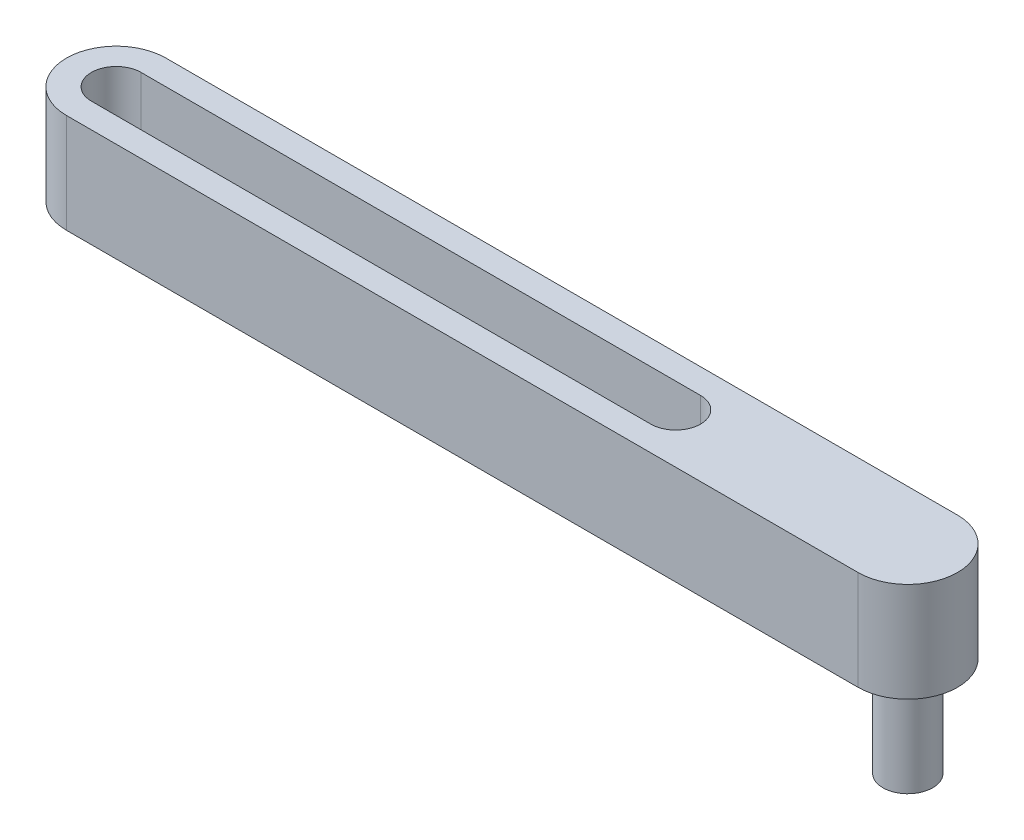
ISO-10303-21;
HEADER;
FILE_DESCRIPTION(('STEP AP214'),'2;1');
FILE_NAME('part.step','',(''),(''),'','','');
FILE_SCHEMA(('AUTOMOTIVE_DESIGN { 1 0 10303 214 1 1 1 1 }'));
ENDSEC;
DATA;
#1=APPLICATION_CONTEXT('core data for automotive mechanical design processes');
#2=APPLICATION_PROTOCOL_DEFINITION('international standard','automotive_design',2000,#1);
#3=PRODUCT_CONTEXT('',#1,'mechanical');
#4=PRODUCT('Part','Part','',(#3));
#5=PRODUCT_RELATED_PRODUCT_CATEGORY('part','',(#4));
#6=PRODUCT_DEFINITION_FORMATION('','',#4);
#7=PRODUCT_DEFINITION_CONTEXT('part definition',#1,'design');
#8=PRODUCT_DEFINITION('design','',#6,#7);
#9=PRODUCT_DEFINITION_SHAPE('','',#8);
#10=(LENGTH_UNIT() NAMED_UNIT(*) SI_UNIT(.MILLI.,.METRE.));
#11=(NAMED_UNIT(*) PLANE_ANGLE_UNIT() SI_UNIT($,.RADIAN.));
#12=(NAMED_UNIT(*) SI_UNIT($,.STERADIAN.) SOLID_ANGLE_UNIT());
#13=UNCERTAINTY_MEASURE_WITH_UNIT(LENGTH_MEASURE(1.E-05),#10,'distance_accuracy_value','');
#14=(GEOMETRIC_REPRESENTATION_CONTEXT(3) GLOBAL_UNCERTAINTY_ASSIGNED_CONTEXT((#13)) GLOBAL_UNIT_ASSIGNED_CONTEXT((#10,
#11,#12)) REPRESENTATION_CONTEXT('',''));
#15=CARTESIAN_POINT('',(0.,0.,0.));
#16=DIRECTION('',(0.,0.,1.));
#17=DIRECTION('',(1.,0.,0.));
#18=AXIS2_PLACEMENT_3D('',#15,#16,#17);
#19=CARTESIAN_POINT('',(177.747691447839,-114.731696712451,24.9730881922548));
#20=DIRECTION('',(0.,1.,0.));
#21=DIRECTION('',(0.,0.,1.));
#22=AXIS2_PLACEMENT_3D('',#19,#20,#21);
#23=PLANE('',#22);
#24=CARTESIAN_POINT('',(177.747691447839,-114.731696712451,24.9730881922548));
#25=DIRECTION('',(0.,1.,0.));
#26=DIRECTION('',(0.,0.,1.));
#27=AXIS2_PLACEMENT_3D('',#24,#25,#26);
#28=CIRCLE('',#27,4.);
#29=CARTESIAN_POINT('',(177.747691447839,-114.731696712451,28.9730881922548));
#30=VERTEX_POINT('',#29);
#31=CARTESIAN_POINT('',(177.747691447839,-114.731696712451,20.9730881922548));
#32=VERTEX_POINT('',#31);
#33=EDGE_CURVE('E137',#30,#32,#28,.T.);
#34=ORIENTED_EDGE('',*,*,#33,.T.);
#35=DIRECTION('',(-1.,0.,0.));
#36=VECTOR('',#35,1.);
#37=CARTESIAN_POINT('',(194.,-114.731696712451,20.9730881922548));
#38=LINE('',#37,#36);
#39=CARTESIAN_POINT('',(114.073911698625,-114.731696712451,20.9730881922549));
#40=VERTEX_POINT('',#39);
#41=EDGE_CURVE('E140',#32,#40,#38,.T.);
#42=ORIENTED_EDGE('',*,*,#41,.T.);
#43=CARTESIAN_POINT('',(114.073911698625,-114.731696712451,24.9730881922549));
#44=DIRECTION('',(0.,1.,0.));
#45=DIRECTION('',(0.,0.,1.));
#46=AXIS2_PLACEMENT_3D('',#43,#44,#45);
#47=CIRCLE('',#46,4.);
#48=CARTESIAN_POINT('',(114.073911698625,-114.731696712451,28.9730881922549));
#49=VERTEX_POINT('',#48);
#50=EDGE_CURVE('E143',#40,#49,#47,.T.);
#51=ORIENTED_EDGE('',*,*,#50,.T.);
#52=DIRECTION('',(-1.,0.,0.));
#53=VECTOR('',#52,1.);
#54=CARTESIAN_POINT('',(194.,-114.731696712451,28.9730881922548));
#55=LINE('',#54,#53);
#56=EDGE_CURVE('E145',#30,#49,#55,.T.);
#57=ORIENTED_EDGE('',*,*,#56,.F.);
#58=EDGE_LOOP('',(#34,#42,#51,#57));
#59=FACE_BOUND('',#58,.T.);
#60=DIRECTION('',(-1.,0.,0.));
#61=VECTOR('',#60,1.);
#62=CARTESIAN_POINT('',(194.,-114.731696712451,22.9730881922549));
#63=LINE('',#62,#61);
#64=CARTESIAN_POINT('',(159.073911698625,-114.731696712451,22.9730881922549));
#65=VERTEX_POINT('',#64);
#66=CARTESIAN_POINT('',(114.073911698625,-114.731696712451,22.9730881922549));
#67=VERTEX_POINT('',#66);
#68=EDGE_CURVE('E108',#65,#67,#63,.T.);
#69=ORIENTED_EDGE('',*,*,#68,.F.);
#70=CARTESIAN_POINT('',(159.073911698625,-114.731696712451,24.9730881922549));
#71=DIRECTION('',(0.,1.,0.));
#72=DIRECTION('',(0.,0.,1.));
#73=AXIS2_PLACEMENT_3D('',#70,#71,#72);
#74=CIRCLE('',#73,1.99999999999998);
#75=CARTESIAN_POINT('',(159.073911698625,-114.731696712451,26.9730881922549));
#76=VERTEX_POINT('',#75);
#77=EDGE_CURVE('E100',#76,#65,#74,.T.);
#78=ORIENTED_EDGE('',*,*,#77,.F.);
#79=DIRECTION('',(-1.,0.,0.));
#80=VECTOR('',#79,1.);
#81=CARTESIAN_POINT('',(194.,-114.731696712451,26.9730881922549));
#82=LINE('',#81,#80);
#83=CARTESIAN_POINT('',(114.073911698625,-114.731696712451,26.9730881922549));
#84=VERTEX_POINT('',#83);
#85=EDGE_CURVE('E122',#76,#84,#82,.T.);
#86=ORIENTED_EDGE('',*,*,#85,.T.);
#87=CARTESIAN_POINT('',(114.073911698625,-114.731696712451,24.9730881922549));
#88=DIRECTION('',(0.,1.,0.));
#89=DIRECTION('',(0.,0.,1.));
#90=AXIS2_PLACEMENT_3D('',#87,#88,#89);
#91=CIRCLE('',#90,1.99999999999998);
#92=EDGE_CURVE('E120',#67,#84,#91,.T.);
#93=ORIENTED_EDGE('',*,*,#92,.F.);
#94=EDGE_LOOP('',(#69,#78,#86,#93));
#95=FACE_BOUND('',#94,.T.);
#96=ADVANCED_FACE('F35',(#59,#95),#23,.T.);
#97=CARTESIAN_POINT('',(177.747691447839,-122.731696712451,24.9730881922548));
#98=DIRECTION('',(0.,1.,0.));
#99=DIRECTION('',(0.,0.,1.));
#100=AXIS2_PLACEMENT_3D('',#97,#98,#99);
#101=PLANE('',#100);
#102=CARTESIAN_POINT('',(177.747691447839,-122.731696712451,24.9730881922548));
#103=DIRECTION('',(0.,1.,0.));
#104=DIRECTION('',(0.,0.,1.));
#105=AXIS2_PLACEMENT_3D('',#102,#103,#104);
#106=CIRCLE('',#105,2.00000000000017);
#107=CARTESIAN_POINT('',(177.747691447839,-122.731696712451,26.973088192255));
#108=VERTEX_POINT('',#107);
#109=EDGE_CURVE('E285',#108,#108,#106,.T.);
#110=ORIENTED_EDGE('',*,*,#109,.T.);
#111=EDGE_LOOP('',(#110));
#112=FACE_BOUND('',#111,.T.);
#113=CARTESIAN_POINT('',(177.747691447839,-122.731696712451,24.9730881922548));
#114=DIRECTION('',(0.,1.,0.));
#115=DIRECTION('',(0.,0.,1.));
#116=AXIS2_PLACEMENT_3D('',#113,#114,#115);
#117=CIRCLE('',#116,4.);
#118=CARTESIAN_POINT('',(177.747691447839,-122.731696712451,28.9730881922548));
#119=VERTEX_POINT('',#118);
#120=CARTESIAN_POINT('',(177.747691447839,-122.731696712451,20.9730881922548));
#121=VERTEX_POINT('',#120);
#122=EDGE_CURVE('E116',#119,#121,#117,.T.);
#123=ORIENTED_EDGE('',*,*,#122,.F.);
#124=DIRECTION('',(-1.,0.,0.));
#125=VECTOR('',#124,1.);
#126=CARTESIAN_POINT('',(194.,-122.731696712451,28.9730881922548));
#127=LINE('',#126,#125);
#128=CARTESIAN_POINT('',(114.073911698625,-122.731696712451,28.9730881922549));
#129=VERTEX_POINT('',#128);
#130=EDGE_CURVE('E141',#119,#129,#127,.T.);
#131=ORIENTED_EDGE('',*,*,#130,.T.);
#132=CARTESIAN_POINT('',(114.073911698625,-122.731696712451,24.9730881922549));
#133=DIRECTION('',(0.,1.,0.));
#134=DIRECTION('',(0.,0.,1.));
#135=AXIS2_PLACEMENT_3D('',#132,#133,#134);
#136=CIRCLE('',#135,4.);
#137=CARTESIAN_POINT('',(114.073911698625,-122.731696712451,20.9730881922549));
#138=VERTEX_POINT('',#137);
#139=EDGE_CURVE('E153',#138,#129,#136,.T.);
#140=ORIENTED_EDGE('',*,*,#139,.F.);
#141=DIRECTION('',(-1.,0.,0.));
#142=VECTOR('',#141,1.);
#143=CARTESIAN_POINT('',(194.,-122.731696712451,20.9730881922548));
#144=LINE('',#143,#142);
#145=EDGE_CURVE('E151',#121,#138,#144,.T.);
#146=ORIENTED_EDGE('',*,*,#145,.F.);
#147=EDGE_LOOP('',(#123,#131,#140,#146));
#148=FACE_BOUND('',#147,.T.);
#149=CARTESIAN_POINT('',(159.073911698625,-122.731696712451,24.9730881922549));
#150=DIRECTION('',(0.,1.,0.));
#151=DIRECTION('',(0.,0.,1.));
#152=AXIS2_PLACEMENT_3D('',#149,#150,#151);
#153=CIRCLE('',#152,1.99999999999998);
#154=CARTESIAN_POINT('',(159.073911698625,-122.731696712451,26.9730881922549));
#155=VERTEX_POINT('',#154);
#156=CARTESIAN_POINT('',(159.073911698625,-122.731696712451,22.9730881922549));
#157=VERTEX_POINT('',#156);
#158=EDGE_CURVE('E58',#155,#157,#153,.T.);
#159=ORIENTED_EDGE('',*,*,#158,.T.);
#160=DIRECTION('',(-1.,0.,0.));
#161=VECTOR('',#160,1.);
#162=CARTESIAN_POINT('',(194.,-122.731696712451,22.9730881922549));
#163=LINE('',#162,#161);
#164=CARTESIAN_POINT('',(114.073911698625,-122.731696712451,22.9730881922549));
#165=VERTEX_POINT('',#164);
#166=EDGE_CURVE('E115',#157,#165,#163,.T.);
#167=ORIENTED_EDGE('',*,*,#166,.T.);
#168=CARTESIAN_POINT('',(114.073911698625,-122.731696712451,24.9730881922549));
#169=DIRECTION('',(0.,1.,0.));
#170=DIRECTION('',(0.,0.,1.));
#171=AXIS2_PLACEMENT_3D('',#168,#169,#170);
#172=CIRCLE('',#171,1.99999999999998);
#173=CARTESIAN_POINT('',(114.073911698625,-122.731696712451,26.9730881922549));
#174=VERTEX_POINT('',#173);
#175=EDGE_CURVE('E130',#165,#174,#172,.T.);
#176=ORIENTED_EDGE('',*,*,#175,.T.);
#177=DIRECTION('',(-1.,0.,0.));
#178=VECTOR('',#177,1.);
#179=CARTESIAN_POINT('',(194.,-122.731696712451,26.9730881922549));
#180=LINE('',#179,#178);
#181=EDGE_CURVE('E109',#155,#174,#180,.T.);
#182=ORIENTED_EDGE('',*,*,#181,.F.);
#183=EDGE_LOOP('',(#159,#167,#176,#182));
#184=FACE_BOUND('',#183,.T.);
#185=ADVANCED_FACE('F170',(#112,#148,#184),#101,.F.);
#186=CARTESIAN_POINT('',(177.747691447839,-114.731696712451,24.9730881922548));
#187=DIRECTION('',(0.,-1.,0.));
#188=DIRECTION('',(0.,0.,-1.));
#189=AXIS2_PLACEMENT_3D('',#186,#187,#188);
#190=CYLINDRICAL_SURFACE('',#189,4.);
#191=ORIENTED_EDGE('',*,*,#122,.T.);
#192=DIRECTION('',(0.,-1.,0.));
#193=VECTOR('',#192,1.);
#194=CARTESIAN_POINT('',(177.747691447839,-114.731696712451,20.9730881922548));
#195=LINE('',#194,#193);
#196=EDGE_CURVE('E11',#32,#121,#195,.T.);
#197=ORIENTED_EDGE('',*,*,#196,.F.);
#198=ORIENTED_EDGE('',*,*,#33,.F.);
#199=DIRECTION('',(0.,-1.,0.));
#200=VECTOR('',#199,1.);
#201=CARTESIAN_POINT('',(177.747691447839,-114.731696712451,28.9730881922548));
#202=LINE('',#201,#200);
#203=EDGE_CURVE('E148',#30,#119,#202,.T.);
#204=ORIENTED_EDGE('',*,*,#203,.T.);
#205=EDGE_LOOP('',(#191,#197,#198,#204));
#206=FACE_BOUND('',#205,.T.);
#207=ADVANCED_FACE('F37',(#206),#190,.T.);
#208=CARTESIAN_POINT('',(194.,-114.731696712451,20.9730881922548));
#209=DIRECTION('',(0.,0.,1.));
#210=DIRECTION('',(1.,0.,0.));
#211=AXIS2_PLACEMENT_3D('',#208,#209,#210);
#212=PLANE('',#211);
#213=ORIENTED_EDGE('',*,*,#145,.T.);
#214=DIRECTION('',(0.,-1.,0.));
#215=VECTOR('',#214,1.);
#216=CARTESIAN_POINT('',(114.073911698625,-114.731696712451,20.9730881922549));
#217=LINE('',#216,#215);
#218=EDGE_CURVE('E43',#40,#138,#217,.T.);
#219=ORIENTED_EDGE('',*,*,#218,.F.);
#220=ORIENTED_EDGE('',*,*,#41,.F.);
#221=ORIENTED_EDGE('',*,*,#196,.T.);
#222=EDGE_LOOP('',(#213,#219,#220,#221));
#223=FACE_BOUND('',#222,.T.);
#224=ADVANCED_FACE('F179',(#223),#212,.F.);
#225=CARTESIAN_POINT('',(114.073911698625,-114.731696712451,24.9730881922549));
#226=DIRECTION('',(0.,-1.,0.));
#227=DIRECTION('',(0.,0.,-1.));
#228=AXIS2_PLACEMENT_3D('',#225,#226,#227);
#229=CYLINDRICAL_SURFACE('',#228,4.);
#230=ORIENTED_EDGE('',*,*,#139,.T.);
#231=DIRECTION('',(0.,-1.,0.));
#232=VECTOR('',#231,1.);
#233=CARTESIAN_POINT('',(114.073911698625,-114.731696712451,28.9730881922549));
#234=LINE('',#233,#232);
#235=EDGE_CURVE('E159',#49,#129,#234,.T.);
#236=ORIENTED_EDGE('',*,*,#235,.F.);
#237=ORIENTED_EDGE('',*,*,#50,.F.);
#238=ORIENTED_EDGE('',*,*,#218,.T.);
#239=EDGE_LOOP('',(#230,#236,#237,#238));
#240=FACE_BOUND('',#239,.T.);
#241=ADVANCED_FACE('F165',(#240),#229,.T.);
#242=CARTESIAN_POINT('',(194.,-114.731696712451,28.9730881922548));
#243=DIRECTION('',(0.,0.,1.));
#244=DIRECTION('',(1.,0.,0.));
#245=AXIS2_PLACEMENT_3D('',#242,#243,#244);
#246=PLANE('',#245);
#247=ORIENTED_EDGE('',*,*,#130,.F.);
#248=ORIENTED_EDGE('',*,*,#203,.F.);
#249=ORIENTED_EDGE('',*,*,#56,.T.);
#250=ORIENTED_EDGE('',*,*,#235,.T.);
#251=EDGE_LOOP('',(#247,#248,#249,#250));
#252=FACE_BOUND('',#251,.T.);
#253=ADVANCED_FACE('F174',(#252),#246,.T.);
#254=CARTESIAN_POINT('',(159.073911698625,-114.731696712451,24.9730881922549));
#255=DIRECTION('',(0.,-1.,0.));
#256=DIRECTION('',(0.,0.,-1.));
#257=AXIS2_PLACEMENT_3D('',#254,#255,#256);
#258=CYLINDRICAL_SURFACE('',#257,1.99999999999998);
#259=ORIENTED_EDGE('',*,*,#158,.F.);
#260=DIRECTION('',(0.,-1.,0.));
#261=VECTOR('',#260,1.);
#262=CARTESIAN_POINT('',(159.073911698625,-114.731696712451,26.9730881922549));
#263=LINE('',#262,#261);
#264=EDGE_CURVE('E104',#76,#155,#263,.T.);
#265=ORIENTED_EDGE('',*,*,#264,.F.);
#266=ORIENTED_EDGE('',*,*,#77,.T.);
#267=DIRECTION('',(0.,-1.,0.));
#268=VECTOR('',#267,1.);
#269=CARTESIAN_POINT('',(159.073911698625,-114.731696712451,22.9730881922549));
#270=LINE('',#269,#268);
#271=EDGE_CURVE('E103',#65,#157,#270,.T.);
#272=ORIENTED_EDGE('',*,*,#271,.T.);
#273=EDGE_LOOP('',(#259,#265,#266,#272));
#274=FACE_BOUND('',#273,.T.);
#275=ADVANCED_FACE('F102',(#274),#258,.F.);
#276=CARTESIAN_POINT('',(194.,-114.731696712451,22.9730881922549));
#277=DIRECTION('',(0.,0.,1.));
#278=DIRECTION('',(1.,0.,0.));
#279=AXIS2_PLACEMENT_3D('',#276,#277,#278);
#280=PLANE('',#279);
#281=ORIENTED_EDGE('',*,*,#166,.F.);
#282=ORIENTED_EDGE('',*,*,#271,.F.);
#283=ORIENTED_EDGE('',*,*,#68,.T.);
#284=DIRECTION('',(0.,-1.,0.));
#285=VECTOR('',#284,1.);
#286=CARTESIAN_POINT('',(114.073911698625,-114.731696712451,22.9730881922549));
#287=LINE('',#286,#285);
#288=EDGE_CURVE('E117',#67,#165,#287,.T.);
#289=ORIENTED_EDGE('',*,*,#288,.T.);
#290=EDGE_LOOP('',(#281,#282,#283,#289));
#291=FACE_BOUND('',#290,.T.);
#292=ADVANCED_FACE('F112',(#291),#280,.T.);
#293=CARTESIAN_POINT('',(114.073911698625,-114.731696712451,24.9730881922549));
#294=DIRECTION('',(0.,-1.,0.));
#295=DIRECTION('',(0.,0.,-1.));
#296=AXIS2_PLACEMENT_3D('',#293,#294,#295);
#297=CYLINDRICAL_SURFACE('',#296,1.99999999999998);
#298=ORIENTED_EDGE('',*,*,#175,.F.);
#299=ORIENTED_EDGE('',*,*,#288,.F.);
#300=ORIENTED_EDGE('',*,*,#92,.T.);
#301=DIRECTION('',(0.,-1.,0.));
#302=VECTOR('',#301,1.);
#303=CARTESIAN_POINT('',(114.073911698625,-114.731696712451,26.9730881922549));
#304=LINE('',#303,#302);
#305=EDGE_CURVE('E50',#84,#174,#304,.T.);
#306=ORIENTED_EDGE('',*,*,#305,.T.);
#307=EDGE_LOOP('',(#298,#299,#300,#306));
#308=FACE_BOUND('',#307,.T.);
#309=ADVANCED_FACE('F220',(#308),#297,.F.);
#310=CARTESIAN_POINT('',(194.,-114.731696712451,26.9730881922549));
#311=DIRECTION('',(0.,0.,1.));
#312=DIRECTION('',(1.,0.,0.));
#313=AXIS2_PLACEMENT_3D('',#310,#311,#312);
#314=PLANE('',#313);
#315=ORIENTED_EDGE('',*,*,#181,.T.);
#316=ORIENTED_EDGE('',*,*,#305,.F.);
#317=ORIENTED_EDGE('',*,*,#85,.F.);
#318=ORIENTED_EDGE('',*,*,#264,.T.);
#319=EDGE_LOOP('',(#315,#316,#317,#318));
#320=FACE_BOUND('',#319,.T.);
#321=ADVANCED_FACE('F227',(#320),#314,.F.);
#322=CARTESIAN_POINT('',(177.747691447839,-130.731696712451,24.9730881922548));
#323=DIRECTION('',(0.,1.,0.));
#324=DIRECTION('',(0.,0.,1.));
#325=AXIS2_PLACEMENT_3D('',#322,#323,#324);
#326=CYLINDRICAL_SURFACE('',#325,2.00000000000017);
#327=CARTESIAN_POINT('',(177.747691447839,-130.731696712451,24.9730881922548));
#328=DIRECTION('',(0.,1.,0.));
#329=DIRECTION('',(0.,0.,1.));
#330=AXIS2_PLACEMENT_3D('',#327,#328,#329);
#331=CIRCLE('',#330,2.00000000000017);
#332=CARTESIAN_POINT('',(177.747691447839,-130.731696712451,26.973088192255));
#333=VERTEX_POINT('',#332);
#334=EDGE_CURVE('E128',#333,#333,#331,.T.);
#335=ORIENTED_EDGE('',*,*,#334,.T.);
#336=EDGE_LOOP('',(#335));
#337=FACE_BOUND('',#336,.T.);
#338=ORIENTED_EDGE('',*,*,#109,.F.);
#339=EDGE_LOOP('',(#338));
#340=FACE_BOUND('',#339,.T.);
#341=ADVANCED_FACE('F236',(#337,#340),#326,.T.);
#342=CARTESIAN_POINT('',(177.747691447839,-130.731696712451,24.9730881922548));
#343=DIRECTION('',(0.,1.,0.));
#344=DIRECTION('',(0.,0.,1.));
#345=AXIS2_PLACEMENT_3D('',#342,#343,#344);
#346=PLANE('',#345);
#347=ORIENTED_EDGE('',*,*,#334,.F.);
#348=EDGE_LOOP('',(#347));
#349=FACE_BOUND('',#348,.T.);
#350=ADVANCED_FACE('F244',(#349),#346,.F.);
#351=CLOSED_SHELL('',(#96,#185,#207,#224,#241,#253,#275,#292,#309,#321,#341,#350));
#352=MANIFOLD_SOLID_BREP('B2',#351);
#353=ADVANCED_BREP_SHAPE_REPRESENTATION('',(#18,#352),#14);
#354=SHAPE_DEFINITION_REPRESENTATION(#9,#353);
ENDSEC;
END-ISO-10303-21;
